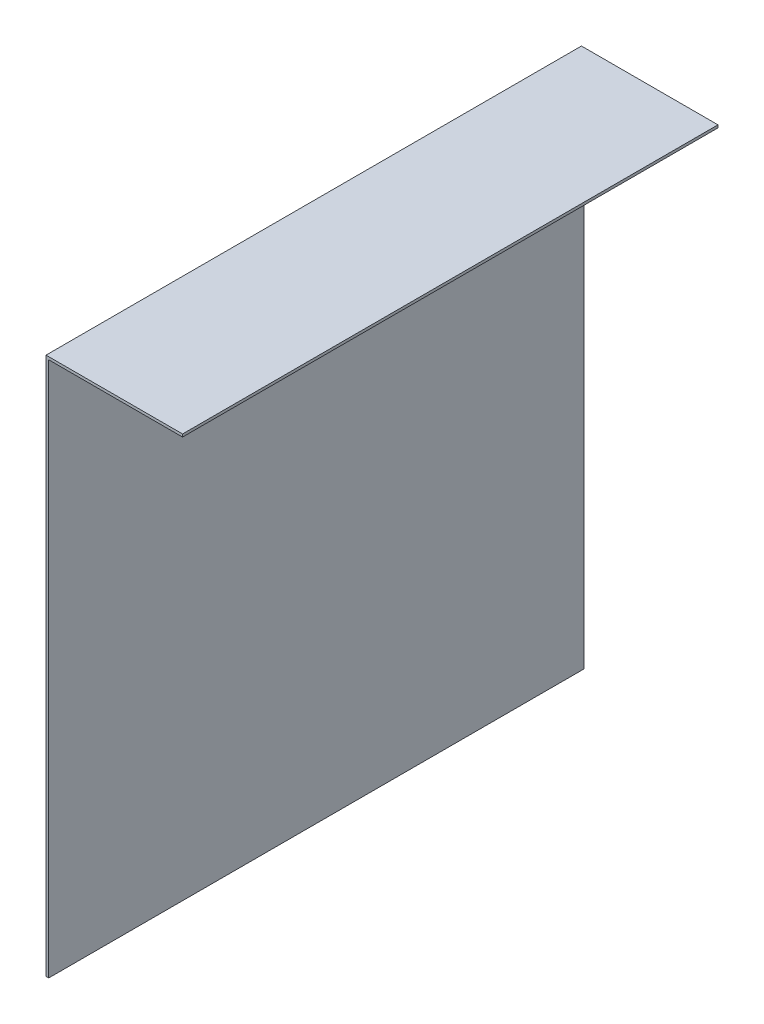
ISO-10303-21;
HEADER;
FILE_DESCRIPTION(('STEP AP214'),'2;1');
FILE_NAME('part.step','',(''),(''),'','','');
FILE_SCHEMA(('AUTOMOTIVE_DESIGN { 1 0 10303 214 1 1 1 1 }'));
ENDSEC;
DATA;
#1=APPLICATION_CONTEXT('core data for automotive mechanical design processes');
#2=APPLICATION_PROTOCOL_DEFINITION('international standard','automotive_design',2000,#1);
#3=PRODUCT_CONTEXT('',#1,'mechanical');
#4=PRODUCT('Part','Part','',(#3));
#5=PRODUCT_RELATED_PRODUCT_CATEGORY('part','',(#4));
#6=PRODUCT_DEFINITION_FORMATION('','',#4);
#7=PRODUCT_DEFINITION_CONTEXT('part definition',#1,'design');
#8=PRODUCT_DEFINITION('design','',#6,#7);
#9=PRODUCT_DEFINITION_SHAPE('','',#8);
#10=(LENGTH_UNIT() NAMED_UNIT(*) SI_UNIT(.MILLI.,.METRE.));
#11=(NAMED_UNIT(*) PLANE_ANGLE_UNIT() SI_UNIT($,.RADIAN.));
#12=(NAMED_UNIT(*) SI_UNIT($,.STERADIAN.) SOLID_ANGLE_UNIT());
#13=UNCERTAINTY_MEASURE_WITH_UNIT(LENGTH_MEASURE(1.E-05),#10,'distance_accuracy_value','');
#14=(GEOMETRIC_REPRESENTATION_CONTEXT(3) GLOBAL_UNCERTAINTY_ASSIGNED_CONTEXT((#13)) GLOBAL_UNIT_ASSIGNED_CONTEXT((#10,
#11,#12)) REPRESENTATION_CONTEXT('',''));
#15=CARTESIAN_POINT('',(0.,0.,0.));
#16=DIRECTION('',(0.,0.,1.));
#17=DIRECTION('',(1.,0.,0.));
#18=AXIS2_PLACEMENT_3D('',#15,#16,#17);
#19=CARTESIAN_POINT('',(0.,0.,600.));
#20=DIRECTION('',(0.,1.,0.));
#21=DIRECTION('',(0.,0.,1.));
#22=AXIS2_PLACEMENT_3D('',#19,#20,#21);
#23=PLANE('',#22);
#24=DIRECTION('',(1.,0.,0.));
#25=VECTOR('',#24,1.);
#26=CARTESIAN_POINT('',(0.,0.,0.));
#27=LINE('',#26,#25);
#28=CARTESIAN_POINT('',(-3.,0.,0.));
#29=VERTEX_POINT('',#28);
#30=CARTESIAN_POINT('',(0.,0.,0.));
#31=VERTEX_POINT('',#30);
#32=EDGE_CURVE('E117',#29,#31,#27,.T.);
#33=ORIENTED_EDGE('',*,*,#32,.T.);
#34=DIRECTION('',(0.,0.,-1.));
#35=VECTOR('',#34,1.);
#36=CARTESIAN_POINT('',(0.,0.,600.));
#37=LINE('',#36,#35);
#38=CARTESIAN_POINT('',(0.,0.,600.));
#39=VERTEX_POINT('',#38);
#40=EDGE_CURVE('E11',#39,#31,#37,.T.);
#41=ORIENTED_EDGE('',*,*,#40,.F.);
#42=DIRECTION('',(1.,0.,0.));
#43=VECTOR('',#42,1.);
#44=CARTESIAN_POINT('',(0.,0.,600.));
#45=LINE('',#44,#43);
#46=CARTESIAN_POINT('',(-3.,0.,600.));
#47=VERTEX_POINT('',#46);
#48=EDGE_CURVE('E127',#47,#39,#45,.T.);
#49=ORIENTED_EDGE('',*,*,#48,.F.);
#50=DIRECTION('',(0.,0.,-1.));
#51=VECTOR('',#50,1.);
#52=CARTESIAN_POINT('',(-3.,0.,600.));
#53=LINE('',#52,#51);
#54=EDGE_CURVE('E113',#47,#29,#53,.T.);
#55=ORIENTED_EDGE('',*,*,#54,.T.);
#56=EDGE_LOOP('',(#33,#41,#49,#55));
#57=FACE_BOUND('',#56,.T.);
#58=ADVANCED_FACE('F33',(#57),#23,.F.);
#59=CARTESIAN_POINT('',(0.,0.,600.));
#60=DIRECTION('',(-1.,0.,0.));
#61=DIRECTION('',(0.,0.,1.));
#62=AXIS2_PLACEMENT_3D('',#59,#60,#61);
#63=PLANE('',#62);
#64=DIRECTION('',(0.,1.,0.));
#65=VECTOR('',#64,1.);
#66=CARTESIAN_POINT('',(0.,0.,0.));
#67=LINE('',#66,#65);
#68=CARTESIAN_POINT('',(0.,600.,0.));
#69=VERTEX_POINT('',#68);
#70=EDGE_CURVE('E120',#31,#69,#67,.T.);
#71=ORIENTED_EDGE('',*,*,#70,.T.);
#72=DIRECTION('',(0.,0.,-1.));
#73=VECTOR('',#72,1.);
#74=CARTESIAN_POINT('',(0.,600.,600.));
#75=LINE('',#74,#73);
#76=CARTESIAN_POINT('',(0.,600.,600.));
#77=VERTEX_POINT('',#76);
#78=EDGE_CURVE('E41',#77,#69,#75,.T.);
#79=ORIENTED_EDGE('',*,*,#78,.F.);
#80=DIRECTION('',(0.,1.,0.));
#81=VECTOR('',#80,1.);
#82=CARTESIAN_POINT('',(0.,0.,600.));
#83=LINE('',#82,#81);
#84=EDGE_CURVE('E86',#39,#77,#83,.T.);
#85=ORIENTED_EDGE('',*,*,#84,.F.);
#86=ORIENTED_EDGE('',*,*,#40,.T.);
#87=EDGE_LOOP('',(#71,#79,#85,#86));
#88=FACE_BOUND('',#87,.T.);
#89=ADVANCED_FACE('F151',(#88),#63,.F.);
#90=CARTESIAN_POINT('',(0.,600.,600.));
#91=DIRECTION('',(0.,1.,0.));
#92=DIRECTION('',(0.,0.,1.));
#93=AXIS2_PLACEMENT_3D('',#90,#91,#92);
#94=PLANE('',#93);
#95=DIRECTION('',(1.,0.,0.));
#96=VECTOR('',#95,1.);
#97=CARTESIAN_POINT('',(0.,600.,0.));
#98=LINE('',#97,#96);
#99=CARTESIAN_POINT('',(150.,600.,0.));
#100=VERTEX_POINT('',#99);
#101=EDGE_CURVE('E122',#69,#100,#98,.T.);
#102=ORIENTED_EDGE('',*,*,#101,.T.);
#103=DIRECTION('',(0.,0.,-1.));
#104=VECTOR('',#103,1.);
#105=CARTESIAN_POINT('',(150.,600.,600.));
#106=LINE('',#105,#104);
#107=CARTESIAN_POINT('',(150.,600.,600.));
#108=VERTEX_POINT('',#107);
#109=EDGE_CURVE('E108',#108,#100,#106,.T.);
#110=ORIENTED_EDGE('',*,*,#109,.F.);
#111=DIRECTION('',(1.,0.,0.));
#112=VECTOR('',#111,1.);
#113=CARTESIAN_POINT('',(0.,600.,600.));
#114=LINE('',#113,#112);
#115=EDGE_CURVE('E99',#77,#108,#114,.T.);
#116=ORIENTED_EDGE('',*,*,#115,.F.);
#117=ORIENTED_EDGE('',*,*,#78,.T.);
#118=EDGE_LOOP('',(#102,#110,#116,#117));
#119=FACE_BOUND('',#118,.T.);
#120=ADVANCED_FACE('F133',(#119),#94,.F.);
#121=CARTESIAN_POINT('',(150.,600.,600.));
#122=DIRECTION('',(-1.,0.,0.));
#123=DIRECTION('',(0.,0.,1.));
#124=AXIS2_PLACEMENT_3D('',#121,#122,#123);
#125=PLANE('',#124);
#126=DIRECTION('',(0.,1.,0.));
#127=VECTOR('',#126,1.);
#128=CARTESIAN_POINT('',(150.,600.,0.));
#129=LINE('',#128,#127);
#130=CARTESIAN_POINT('',(150.,603.,0.));
#131=VERTEX_POINT('',#130);
#132=EDGE_CURVE('E107',#100,#131,#129,.T.);
#133=ORIENTED_EDGE('',*,*,#132,.T.);
#134=DIRECTION('',(0.,0.,-1.));
#135=VECTOR('',#134,1.);
#136=CARTESIAN_POINT('',(150.,603.,600.));
#137=LINE('',#136,#135);
#138=CARTESIAN_POINT('',(150.,603.,600.));
#139=VERTEX_POINT('',#138);
#140=EDGE_CURVE('E104',#139,#131,#137,.T.);
#141=ORIENTED_EDGE('',*,*,#140,.F.);
#142=DIRECTION('',(0.,1.,0.));
#143=VECTOR('',#142,1.);
#144=CARTESIAN_POINT('',(150.,600.,600.));
#145=LINE('',#144,#143);
#146=EDGE_CURVE('E93',#108,#139,#145,.T.);
#147=ORIENTED_EDGE('',*,*,#146,.F.);
#148=ORIENTED_EDGE('',*,*,#109,.T.);
#149=EDGE_LOOP('',(#133,#141,#147,#148));
#150=FACE_BOUND('',#149,.T.);
#151=ADVANCED_FACE('F105',(#150),#125,.F.);
#152=CARTESIAN_POINT('',(-3.,603.,600.));
#153=DIRECTION('',(0.,-1.,0.));
#154=DIRECTION('',(0.,0.,-1.));
#155=AXIS2_PLACEMENT_3D('',#152,#153,#154);
#156=PLANE('',#155);
#157=DIRECTION('',(-1.,0.,0.));
#158=VECTOR('',#157,1.);
#159=CARTESIAN_POINT('',(-3.,603.,0.));
#160=LINE('',#159,#158);
#161=CARTESIAN_POINT('',(-3.,603.,0.));
#162=VERTEX_POINT('',#161);
#163=EDGE_CURVE('E72',#131,#162,#160,.T.);
#164=ORIENTED_EDGE('',*,*,#163,.T.);
#165=DIRECTION('',(0.,0.,-1.));
#166=VECTOR('',#165,1.);
#167=CARTESIAN_POINT('',(-3.,603.,600.));
#168=LINE('',#167,#166);
#169=CARTESIAN_POINT('',(-3.,603.,600.));
#170=VERTEX_POINT('',#169);
#171=EDGE_CURVE('E109',#170,#162,#168,.T.);
#172=ORIENTED_EDGE('',*,*,#171,.F.);
#173=DIRECTION('',(-1.,0.,0.));
#174=VECTOR('',#173,1.);
#175=CARTESIAN_POINT('',(-3.,603.,600.));
#176=LINE('',#175,#174);
#177=EDGE_CURVE('E97',#139,#170,#176,.T.);
#178=ORIENTED_EDGE('',*,*,#177,.F.);
#179=ORIENTED_EDGE('',*,*,#140,.T.);
#180=EDGE_LOOP('',(#164,#172,#178,#179));
#181=FACE_BOUND('',#180,.T.);
#182=ADVANCED_FACE('F111',(#181),#156,.F.);
#183=CARTESIAN_POINT('',(-3.,0.,600.));
#184=DIRECTION('',(1.,0.,0.));
#185=DIRECTION('',(0.,0.,-1.));
#186=AXIS2_PLACEMENT_3D('',#183,#184,#185);
#187=PLANE('',#186);
#188=DIRECTION('',(0.,-1.,0.));
#189=VECTOR('',#188,1.);
#190=CARTESIAN_POINT('',(-3.,0.,0.));
#191=LINE('',#190,#189);
#192=EDGE_CURVE('E78',#162,#29,#191,.T.);
#193=ORIENTED_EDGE('',*,*,#192,.T.);
#194=ORIENTED_EDGE('',*,*,#54,.F.);
#195=DIRECTION('',(0.,-1.,0.));
#196=VECTOR('',#195,1.);
#197=CARTESIAN_POINT('',(-3.,0.,600.));
#198=LINE('',#197,#196);
#199=EDGE_CURVE('E49',#170,#47,#198,.T.);
#200=ORIENTED_EDGE('',*,*,#199,.F.);
#201=ORIENTED_EDGE('',*,*,#171,.T.);
#202=EDGE_LOOP('',(#193,#194,#200,#201));
#203=FACE_BOUND('',#202,.T.);
#204=ADVANCED_FACE('F140',(#203),#187,.F.);
#205=CARTESIAN_POINT('',(0.,0.,600.));
#206=DIRECTION('',(0.,0.,-1.));
#207=DIRECTION('',(-1.,0.,0.));
#208=AXIS2_PLACEMENT_3D('',#205,#206,#207);
#209=PLANE('',#208);
#210=ORIENTED_EDGE('',*,*,#48,.T.);
#211=ORIENTED_EDGE('',*,*,#84,.T.);
#212=ORIENTED_EDGE('',*,*,#115,.T.);
#213=ORIENTED_EDGE('',*,*,#146,.T.);
#214=ORIENTED_EDGE('',*,*,#177,.T.);
#215=ORIENTED_EDGE('',*,*,#199,.T.);
#216=EDGE_LOOP('',(#210,#211,#212,#213,#214,#215));
#217=FACE_BOUND('',#216,.T.);
#218=ADVANCED_FACE('F95',(#217),#209,.F.);
#219=CARTESIAN_POINT('',(0.,0.,0.));
#220=DIRECTION('',(0.,0.,-1.));
#221=DIRECTION('',(-1.,0.,0.));
#222=AXIS2_PLACEMENT_3D('',#219,#220,#221);
#223=PLANE('',#222);
#224=ORIENTED_EDGE('',*,*,#32,.F.);
#225=ORIENTED_EDGE('',*,*,#192,.F.);
#226=ORIENTED_EDGE('',*,*,#163,.F.);
#227=ORIENTED_EDGE('',*,*,#132,.F.);
#228=ORIENTED_EDGE('',*,*,#101,.F.);
#229=ORIENTED_EDGE('',*,*,#70,.F.);
#230=EDGE_LOOP('',(#224,#225,#226,#227,#228,#229));
#231=FACE_BOUND('',#230,.T.);
#232=ADVANCED_FACE('F136',(#231),#223,.T.);
#233=CLOSED_SHELL('',(#58,#89,#120,#151,#182,#204,#218,#232));
#234=MANIFOLD_SOLID_BREP('B2',#233);
#235=ADVANCED_BREP_SHAPE_REPRESENTATION('',(#18,#234),#14);
#236=SHAPE_DEFINITION_REPRESENTATION(#9,#235);
ENDSEC;
END-ISO-10303-21;
